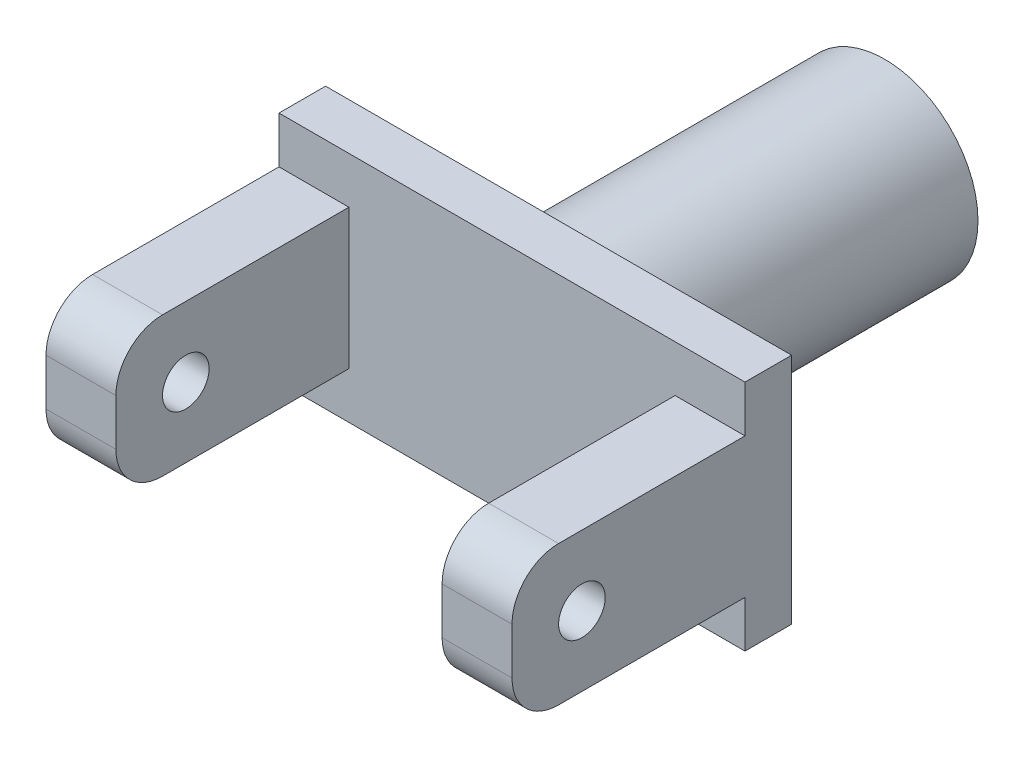
ISO-10303-21;
HEADER;
FILE_DESCRIPTION(('STEP AP214'),'2;1');
FILE_NAME('part.step','',(''),(''),'','','');
FILE_SCHEMA(('AUTOMOTIVE_DESIGN { 1 0 10303 214 1 1 1 1 }'));
ENDSEC;
DATA;
#1=APPLICATION_CONTEXT('core data for automotive mechanical design processes');
#2=APPLICATION_PROTOCOL_DEFINITION('international standard','automotive_design',2000,#1);
#3=PRODUCT_CONTEXT('',#1,'mechanical');
#4=PRODUCT('Part','Part','',(#3));
#5=PRODUCT_RELATED_PRODUCT_CATEGORY('part','',(#4));
#6=PRODUCT_DEFINITION_FORMATION('','',#4);
#7=PRODUCT_DEFINITION_CONTEXT('part definition',#1,'design');
#8=PRODUCT_DEFINITION('design','',#6,#7);
#9=PRODUCT_DEFINITION_SHAPE('','',#8);
#10=(LENGTH_UNIT() NAMED_UNIT(*) SI_UNIT(.MILLI.,.METRE.));
#11=(NAMED_UNIT(*) PLANE_ANGLE_UNIT() SI_UNIT($,.RADIAN.));
#12=(NAMED_UNIT(*) SI_UNIT($,.STERADIAN.) SOLID_ANGLE_UNIT());
#13=UNCERTAINTY_MEASURE_WITH_UNIT(LENGTH_MEASURE(1.E-05),#10,'distance_accuracy_value','');
#14=(GEOMETRIC_REPRESENTATION_CONTEXT(3) GLOBAL_UNCERTAINTY_ASSIGNED_CONTEXT((#13)) GLOBAL_UNIT_ASSIGNED_CONTEXT((#10,
#11,#12)) REPRESENTATION_CONTEXT('',''));
#15=CARTESIAN_POINT('',(0.,0.,0.));
#16=DIRECTION('',(0.,0.,1.));
#17=DIRECTION('',(1.,0.,0.));
#18=AXIS2_PLACEMENT_3D('',#15,#16,#17);
#19=CARTESIAN_POINT('',(0.,0.,80.));
#20=DIRECTION('',(0.,0.,-1.));
#21=DIRECTION('',(-1.,0.,0.));
#22=AXIS2_PLACEMENT_3D('',#19,#20,#21);
#23=PLANE('',#22);
#24=DIRECTION('',(0.,1.,0.));
#25=VECTOR('',#24,1.);
#26=CARTESIAN_POINT('',(50.,-25.,80.));
#27=LINE('',#26,#25);
#28=CARTESIAN_POINT('',(50.,-25.,80.));
#29=VERTEX_POINT('',#28);
#30=CARTESIAN_POINT('',(50.,-15.,80.));
#31=VERTEX_POINT('',#30);
#32=EDGE_CURVE('E171',#29,#31,#27,.T.);
#33=ORIENTED_EDGE('',*,*,#32,.T.);
#34=DIRECTION('',(-1.,0.,0.));
#35=VECTOR('',#34,1.);
#36=CARTESIAN_POINT('',(50.,-15.,80.));
#37=LINE('',#36,#35);
#38=CARTESIAN_POINT('',(35.,-15.,80.));
#39=VERTEX_POINT('',#38);
#40=EDGE_CURVE('E180',#31,#39,#37,.T.);
#41=ORIENTED_EDGE('',*,*,#40,.T.);
#42=DIRECTION('',(0.,1.,0.));
#43=VECTOR('',#42,1.);
#44=CARTESIAN_POINT('',(35.,-15.,80.));
#45=LINE('',#44,#43);
#46=CARTESIAN_POINT('',(35.,15.,80.));
#47=VERTEX_POINT('',#46);
#48=EDGE_CURVE('E178',#39,#47,#45,.T.);
#49=ORIENTED_EDGE('',*,*,#48,.T.);
#50=DIRECTION('',(1.,0.,0.));
#51=VECTOR('',#50,1.);
#52=CARTESIAN_POINT('',(50.,15.,80.));
#53=LINE('',#52,#51);
#54=CARTESIAN_POINT('',(50.,15.,80.));
#55=VERTEX_POINT('',#54);
#56=EDGE_CURVE('E156',#47,#55,#53,.T.);
#57=ORIENTED_EDGE('',*,*,#56,.T.);
#58=CARTESIAN_POINT('',(50.,25.,80.));
#59=VERTEX_POINT('',#58);
#60=EDGE_CURVE('E164',#55,#59,#27,.T.);
#61=ORIENTED_EDGE('',*,*,#60,.T.);
#62=DIRECTION('',(-1.,0.,0.));
#63=VECTOR('',#62,1.);
#64=CARTESIAN_POINT('',(-50.,25.,80.));
#65=LINE('',#64,#63);
#66=CARTESIAN_POINT('',(-50.,25.,80.));
#67=VERTEX_POINT('',#66);
#68=EDGE_CURVE('E392',#59,#67,#65,.T.);
#69=ORIENTED_EDGE('',*,*,#68,.T.);
#70=DIRECTION('',(0.,-1.,0.));
#71=VECTOR('',#70,1.);
#72=CARTESIAN_POINT('',(-50.,-25.,80.));
#73=LINE('',#72,#71);
#74=CARTESIAN_POINT('',(-50.,15.,80.));
#75=VERTEX_POINT('',#74);
#76=EDGE_CURVE('E387',#67,#75,#73,.T.);
#77=ORIENTED_EDGE('',*,*,#76,.T.);
#78=DIRECTION('',(-1.,0.,0.));
#79=VECTOR('',#78,1.);
#80=CARTESIAN_POINT('',(-50.,15.,80.));
#81=LINE('',#80,#79);
#82=CARTESIAN_POINT('',(-35.,15.,80.));
#83=VERTEX_POINT('',#82);
#84=EDGE_CURVE('E206',#83,#75,#81,.T.);
#85=ORIENTED_EDGE('',*,*,#84,.F.);
#86=DIRECTION('',(0.,1.,0.));
#87=VECTOR('',#86,1.);
#88=CARTESIAN_POINT('',(-35.,-15.,80.));
#89=LINE('',#88,#87);
#90=CARTESIAN_POINT('',(-35.,-15.,80.));
#91=VERTEX_POINT('',#90);
#92=EDGE_CURVE('E203',#91,#83,#89,.T.);
#93=ORIENTED_EDGE('',*,*,#92,.F.);
#94=DIRECTION('',(1.,0.,0.));
#95=VECTOR('',#94,1.);
#96=CARTESIAN_POINT('',(-50.,-15.,80.));
#97=LINE('',#96,#95);
#98=CARTESIAN_POINT('',(-50.,-15.,80.));
#99=VERTEX_POINT('',#98);
#100=EDGE_CURVE('E199',#99,#91,#97,.T.);
#101=ORIENTED_EDGE('',*,*,#100,.F.);
#102=CARTESIAN_POINT('',(-50.,-25.,80.));
#103=VERTEX_POINT('',#102);
#104=EDGE_CURVE('E214',#99,#103,#73,.T.);
#105=ORIENTED_EDGE('',*,*,#104,.T.);
#106=DIRECTION('',(1.,0.,0.));
#107=VECTOR('',#106,1.);
#108=CARTESIAN_POINT('',(-50.,-25.,80.));
#109=LINE('',#108,#107);
#110=EDGE_CURVE('E388',#103,#29,#109,.T.);
#111=ORIENTED_EDGE('',*,*,#110,.T.);
#112=EDGE_LOOP('',(#33,#41,#49,#57,#61,#69,#77,#85,#93,#101,#105,#111));
#113=FACE_BOUND('',#112,.T.);
#114=ADVANCED_FACE('F34',(#113),#23,.F.);
#115=CARTESIAN_POINT('',(0.,0.,0.));
#116=DIRECTION('',(0.,0.,1.));
#117=DIRECTION('',(1.,0.,0.));
#118=AXIS2_PLACEMENT_3D('',#115,#116,#117);
#119=PLANE('',#118);
#120=CARTESIAN_POINT('',(0.,0.,0.));
#121=DIRECTION('',(0.,0.,1.));
#122=DIRECTION('',(1.,0.,0.));
#123=AXIS2_PLACEMENT_3D('',#120,#121,#122);
#124=CIRCLE('',#123,20.);
#125=CARTESIAN_POINT('',(20.,0.,0.));
#126=VERTEX_POINT('',#125);
#127=EDGE_CURVE('E377',#126,#126,#124,.T.);
#128=ORIENTED_EDGE('',*,*,#127,.F.);
#129=EDGE_LOOP('',(#128));
#130=FACE_BOUND('',#129,.T.);
#131=CARTESIAN_POINT('',(0.,0.,0.));
#132=DIRECTION('',(0.,0.,1.));
#133=DIRECTION('',(1.,0.,0.));
#134=AXIS2_PLACEMENT_3D('',#131,#132,#133);
#135=CIRCLE('',#134,15.);
#136=CARTESIAN_POINT('',(15.,0.,0.));
#137=VERTEX_POINT('',#136);
#138=EDGE_CURVE('E383',#137,#137,#135,.T.);
#139=ORIENTED_EDGE('',*,*,#138,.T.);
#140=EDGE_LOOP('',(#139));
#141=FACE_BOUND('',#140,.T.);
#142=ADVANCED_FACE('F279',(#130,#141),#119,.F.);
#143=CARTESIAN_POINT('',(0.,0.,70.));
#144=DIRECTION('',(0.,0.,-1.));
#145=DIRECTION('',(-1.,0.,0.));
#146=AXIS2_PLACEMENT_3D('',#143,#144,#145);
#147=CYLINDRICAL_SURFACE('',#146,20.);
#148=CARTESIAN_POINT('',(0.,0.,70.));
#149=DIRECTION('',(0.,0.,1.));
#150=DIRECTION('',(1.,0.,0.));
#151=AXIS2_PLACEMENT_3D('',#148,#149,#150);
#152=CIRCLE('',#151,20.);
#153=CARTESIAN_POINT('',(20.,0.,70.));
#154=VERTEX_POINT('',#153);
#155=EDGE_CURVE('E374',#154,#154,#152,.T.);
#156=ORIENTED_EDGE('',*,*,#155,.F.);
#157=EDGE_LOOP('',(#156));
#158=FACE_BOUND('',#157,.T.);
#159=ORIENTED_EDGE('',*,*,#127,.T.);
#160=EDGE_LOOP('',(#159));
#161=FACE_BOUND('',#160,.T.);
#162=ADVANCED_FACE('F284',(#158,#161),#147,.T.);
#163=CARTESIAN_POINT('',(0.,0.,70.));
#164=DIRECTION('',(0.,0.,-1.));
#165=DIRECTION('',(-1.,0.,0.));
#166=AXIS2_PLACEMENT_3D('',#163,#164,#165);
#167=CYLINDRICAL_SURFACE('',#166,15.);
#168=CARTESIAN_POINT('',(0.,0.,70.));
#169=DIRECTION('',(0.,0.,-1.));
#170=DIRECTION('',(-1.,0.,0.));
#171=AXIS2_PLACEMENT_3D('',#168,#169,#170);
#172=CIRCLE('',#171,15.);
#173=CARTESIAN_POINT('',(-15.,0.,70.));
#174=VERTEX_POINT('',#173);
#175=EDGE_CURVE('E411',#174,#174,#172,.T.);
#176=ORIENTED_EDGE('',*,*,#175,.F.);
#177=EDGE_LOOP('',(#176));
#178=FACE_BOUND('',#177,.T.);
#179=ORIENTED_EDGE('',*,*,#138,.F.);
#180=EDGE_LOOP('',(#179));
#181=FACE_BOUND('',#180,.T.);
#182=ADVANCED_FACE('F310',(#178,#181),#167,.F.);
#183=CARTESIAN_POINT('',(0.,0.,70.));
#184=DIRECTION('',(0.,0.,-1.));
#185=DIRECTION('',(-1.,0.,0.));
#186=AXIS2_PLACEMENT_3D('',#183,#184,#185);
#187=PLANE('',#186);
#188=ORIENTED_EDGE('',*,*,#175,.T.);
#189=EDGE_LOOP('',(#188));
#190=FACE_BOUND('',#189,.T.);
#191=ADVANCED_FACE('F296',(#190),#187,.T.);
#192=CARTESIAN_POINT('',(50.,-25.,80.));
#193=DIRECTION('',(-1.,0.,0.));
#194=DIRECTION('',(0.,0.,1.));
#195=AXIS2_PLACEMENT_3D('',#192,#193,#194);
#196=PLANE('',#195);
#197=CARTESIAN_POINT('',(50.,0.,115.));
#198=DIRECTION('',(-1.,0.,0.));
#199=DIRECTION('',(0.,0.,1.));
#200=AXIS2_PLACEMENT_3D('',#197,#198,#199);
#201=CIRCLE('',#200,5.);
#202=CARTESIAN_POINT('',(50.,0.,120.));
#203=VERTEX_POINT('',#202);
#204=EDGE_CURVE('E263',#203,#203,#201,.T.);
#205=ORIENTED_EDGE('',*,*,#204,.T.);
#206=EDGE_LOOP('',(#205));
#207=FACE_BOUND('',#206,.T.);
#208=DIRECTION('',(0.,0.,-1.));
#209=VECTOR('',#208,1.);
#210=CARTESIAN_POINT('',(50.,15.,130.));
#211=LINE('',#210,#209);
#212=CARTESIAN_POINT('',(50.,15.,120.));
#213=VERTEX_POINT('',#212);
#214=EDGE_CURVE('E151',#213,#55,#211,.T.);
#215=ORIENTED_EDGE('',*,*,#214,.F.);
#216=CARTESIAN_POINT('',(50.,4.99999999999999,120.));
#217=DIRECTION('',(-1.,0.,0.));
#218=DIRECTION('',(0.,0.,1.));
#219=AXIS2_PLACEMENT_3D('',#216,#217,#218);
#220=CIRCLE('',#219,10.);
#221=CARTESIAN_POINT('',(50.,4.99999999999999,130.));
#222=VERTEX_POINT('',#221);
#223=EDGE_CURVE('E246',#213,#222,#220,.F.);
#224=ORIENTED_EDGE('',*,*,#223,.T.);
#225=DIRECTION('',(0.,-1.,0.));
#226=VECTOR('',#225,1.);
#227=CARTESIAN_POINT('',(50.,-15.,130.));
#228=LINE('',#227,#226);
#229=CARTESIAN_POINT('',(50.,-4.99999999999998,130.));
#230=VERTEX_POINT('',#229);
#231=EDGE_CURVE('E182',#222,#230,#228,.T.);
#232=ORIENTED_EDGE('',*,*,#231,.T.);
#233=CARTESIAN_POINT('',(50.,-4.99999999999998,120.));
#234=DIRECTION('',(-1.,0.,0.));
#235=DIRECTION('',(0.,0.,1.));
#236=AXIS2_PLACEMENT_3D('',#233,#234,#235);
#237=CIRCLE('',#236,10.);
#238=CARTESIAN_POINT('',(50.,-15.,120.));
#239=VERTEX_POINT('',#238);
#240=EDGE_CURVE('E244',#230,#239,#237,.F.);
#241=ORIENTED_EDGE('',*,*,#240,.T.);
#242=DIRECTION('',(0.,0.,-1.));
#243=VECTOR('',#242,1.);
#244=CARTESIAN_POINT('',(50.,-15.,130.));
#245=LINE('',#244,#243);
#246=EDGE_CURVE('E160',#239,#31,#245,.T.);
#247=ORIENTED_EDGE('',*,*,#246,.T.);
#248=ORIENTED_EDGE('',*,*,#32,.F.);
#249=DIRECTION('',(0.,0.,-1.));
#250=VECTOR('',#249,1.);
#251=CARTESIAN_POINT('',(50.,-25.,80.));
#252=LINE('',#251,#250);
#253=CARTESIAN_POINT('',(50.,-25.,70.));
#254=VERTEX_POINT('',#253);
#255=EDGE_CURVE('E395',#29,#254,#252,.T.);
#256=ORIENTED_EDGE('',*,*,#255,.T.);
#257=DIRECTION('',(0.,1.,0.));
#258=VECTOR('',#257,1.);
#259=CARTESIAN_POINT('',(50.,-25.,70.));
#260=LINE('',#259,#258);
#261=CARTESIAN_POINT('',(50.,25.,70.));
#262=VERTEX_POINT('',#261);
#263=EDGE_CURVE('E396',#254,#262,#260,.T.);
#264=ORIENTED_EDGE('',*,*,#263,.T.);
#265=DIRECTION('',(0.,0.,-1.));
#266=VECTOR('',#265,1.);
#267=CARTESIAN_POINT('',(50.,25.,80.));
#268=LINE('',#267,#266);
#269=EDGE_CURVE('E168',#59,#262,#268,.T.);
#270=ORIENTED_EDGE('',*,*,#269,.F.);
#271=ORIENTED_EDGE('',*,*,#60,.F.);
#272=EDGE_LOOP('',(#215,#224,#232,#241,#247,#248,#256,#264,#270,#271));
#273=FACE_BOUND('',#272,.T.);
#274=ADVANCED_FACE('F165',(#207,#273),#196,.F.);
#275=CARTESIAN_POINT('',(-50.,25.,80.));
#276=DIRECTION('',(0.,-1.,0.));
#277=DIRECTION('',(0.,0.,-1.));
#278=AXIS2_PLACEMENT_3D('',#275,#276,#277);
#279=PLANE('',#278);
#280=DIRECTION('',(-1.,0.,0.));
#281=VECTOR('',#280,1.);
#282=CARTESIAN_POINT('',(-50.,25.,70.));
#283=LINE('',#282,#281);
#284=CARTESIAN_POINT('',(-50.,25.,70.));
#285=VERTEX_POINT('',#284);
#286=EDGE_CURVE('E398',#262,#285,#283,.T.);
#287=ORIENTED_EDGE('',*,*,#286,.T.);
#288=DIRECTION('',(0.,0.,-1.));
#289=VECTOR('',#288,1.);
#290=CARTESIAN_POINT('',(-50.,25.,80.));
#291=LINE('',#290,#289);
#292=EDGE_CURVE('E408',#67,#285,#291,.T.);
#293=ORIENTED_EDGE('',*,*,#292,.F.);
#294=ORIENTED_EDGE('',*,*,#68,.F.);
#295=ORIENTED_EDGE('',*,*,#269,.T.);
#296=EDGE_LOOP('',(#287,#293,#294,#295));
#297=FACE_BOUND('',#296,.T.);
#298=ADVANCED_FACE('F303',(#297),#279,.F.);
#299=CARTESIAN_POINT('',(-50.,-25.,80.));
#300=DIRECTION('',(1.,0.,0.));
#301=DIRECTION('',(0.,0.,-1.));
#302=AXIS2_PLACEMENT_3D('',#299,#300,#301);
#303=PLANE('',#302);
#304=CARTESIAN_POINT('',(-50.,0.,115.));
#305=DIRECTION('',(-1.,0.,0.));
#306=DIRECTION('',(0.,0.,1.));
#307=AXIS2_PLACEMENT_3D('',#304,#305,#306);
#308=CIRCLE('',#307,5.);
#309=CARTESIAN_POINT('',(-50.,0.,120.));
#310=VERTEX_POINT('',#309);
#311=EDGE_CURVE('E191',#310,#310,#308,.T.);
#312=ORIENTED_EDGE('',*,*,#311,.F.);
#313=EDGE_LOOP('',(#312));
#314=FACE_BOUND('',#313,.T.);
#315=DIRECTION('',(0.,-1.,0.));
#316=VECTOR('',#315,1.);
#317=CARTESIAN_POINT('',(-50.,-15.,130.));
#318=LINE('',#317,#316);
#319=CARTESIAN_POINT('',(-50.,4.99999999999999,130.));
#320=VERTEX_POINT('',#319);
#321=CARTESIAN_POINT('',(-50.,-4.99999999999998,130.));
#322=VERTEX_POINT('',#321);
#323=EDGE_CURVE('E198',#320,#322,#318,.T.);
#324=ORIENTED_EDGE('',*,*,#323,.F.);
#325=CARTESIAN_POINT('',(-50.,4.99999999999999,120.));
#326=DIRECTION('',(1.,0.,0.));
#327=DIRECTION('',(0.,0.,-1.));
#328=AXIS2_PLACEMENT_3D('',#325,#326,#327);
#329=CIRCLE('',#328,10.);
#330=CARTESIAN_POINT('',(-50.,15.,120.));
#331=VERTEX_POINT('',#330);
#332=EDGE_CURVE('E230',#320,#331,#329,.F.);
#333=ORIENTED_EDGE('',*,*,#332,.T.);
#334=DIRECTION('',(0.,0.,-1.));
#335=VECTOR('',#334,1.);
#336=CARTESIAN_POINT('',(-50.,15.,130.));
#337=LINE('',#336,#335);
#338=EDGE_CURVE('E221',#331,#75,#337,.T.);
#339=ORIENTED_EDGE('',*,*,#338,.T.);
#340=ORIENTED_EDGE('',*,*,#76,.F.);
#341=ORIENTED_EDGE('',*,*,#292,.T.);
#342=DIRECTION('',(0.,-1.,0.));
#343=VECTOR('',#342,1.);
#344=CARTESIAN_POINT('',(-50.,-25.,70.));
#345=LINE('',#344,#343);
#346=CARTESIAN_POINT('',(-50.,-25.,70.));
#347=VERTEX_POINT('',#346);
#348=EDGE_CURVE('E400',#285,#347,#345,.T.);
#349=ORIENTED_EDGE('',*,*,#348,.T.);
#350=DIRECTION('',(0.,0.,-1.));
#351=VECTOR('',#350,1.);
#352=CARTESIAN_POINT('',(-50.,-25.,80.));
#353=LINE('',#352,#351);
#354=EDGE_CURVE('E405',#103,#347,#353,.T.);
#355=ORIENTED_EDGE('',*,*,#354,.F.);
#356=ORIENTED_EDGE('',*,*,#104,.F.);
#357=DIRECTION('',(0.,0.,-1.));
#358=VECTOR('',#357,1.);
#359=CARTESIAN_POINT('',(-50.,-15.,130.));
#360=LINE('',#359,#358);
#361=CARTESIAN_POINT('',(-50.,-15.,120.));
#362=VERTEX_POINT('',#361);
#363=EDGE_CURVE('E225',#362,#99,#360,.T.);
#364=ORIENTED_EDGE('',*,*,#363,.F.);
#365=CARTESIAN_POINT('',(-50.,-4.99999999999998,120.));
#366=DIRECTION('',(1.,0.,0.));
#367=DIRECTION('',(0.,0.,-1.));
#368=AXIS2_PLACEMENT_3D('',#365,#366,#367);
#369=CIRCLE('',#368,10.);
#370=EDGE_CURVE('E228',#362,#322,#369,.F.);
#371=ORIENTED_EDGE('',*,*,#370,.T.);
#372=EDGE_LOOP('',(#324,#333,#339,#340,#341,#349,#355,#356,#364,#371));
#373=FACE_BOUND('',#372,.T.);
#374=ADVANCED_FACE('F299',(#314,#373),#303,.F.);
#375=CARTESIAN_POINT('',(-50.,-25.,80.));
#376=DIRECTION('',(0.,1.,0.));
#377=DIRECTION('',(0.,0.,1.));
#378=AXIS2_PLACEMENT_3D('',#375,#376,#377);
#379=PLANE('',#378);
#380=DIRECTION('',(1.,0.,0.));
#381=VECTOR('',#380,1.);
#382=CARTESIAN_POINT('',(-50.,-25.,70.));
#383=LINE('',#382,#381);
#384=EDGE_CURVE('E172',#347,#254,#383,.T.);
#385=ORIENTED_EDGE('',*,*,#384,.T.);
#386=ORIENTED_EDGE('',*,*,#255,.F.);
#387=ORIENTED_EDGE('',*,*,#110,.F.);
#388=ORIENTED_EDGE('',*,*,#354,.T.);
#389=EDGE_LOOP('',(#385,#386,#387,#388));
#390=FACE_BOUND('',#389,.T.);
#391=ADVANCED_FACE('F294',(#390),#379,.F.);
#392=ORIENTED_EDGE('',*,*,#155,.T.);
#393=EDGE_LOOP('',(#392));
#394=FACE_BOUND('',#393,.T.);
#395=ORIENTED_EDGE('',*,*,#263,.F.);
#396=ORIENTED_EDGE('',*,*,#384,.F.);
#397=ORIENTED_EDGE('',*,*,#348,.F.);
#398=ORIENTED_EDGE('',*,*,#286,.F.);
#399=EDGE_LOOP('',(#395,#396,#397,#398));
#400=FACE_BOUND('',#399,.T.);
#401=ADVANCED_FACE('F291',(#394,#400),#187,.T.);
#402=CARTESIAN_POINT('',(-35.,-15.,130.));
#403=DIRECTION('',(-1.,0.,0.));
#404=DIRECTION('',(0.,0.,1.));
#405=AXIS2_PLACEMENT_3D('',#402,#403,#404);
#406=PLANE('',#405);
#407=CARTESIAN_POINT('',(-35.,0.,115.));
#408=DIRECTION('',(-1.,0.,0.));
#409=DIRECTION('',(0.,0.,1.));
#410=AXIS2_PLACEMENT_3D('',#407,#408,#409);
#411=CIRCLE('',#410,5.);
#412=CARTESIAN_POINT('',(-35.,0.,120.));
#413=VERTEX_POINT('',#412);
#414=EDGE_CURVE('E194',#413,#413,#411,.T.);
#415=ORIENTED_EDGE('',*,*,#414,.T.);
#416=EDGE_LOOP('',(#415));
#417=FACE_BOUND('',#416,.T.);
#418=DIRECTION('',(0.,0.,-1.));
#419=VECTOR('',#418,1.);
#420=CARTESIAN_POINT('',(-35.,15.,130.));
#421=LINE('',#420,#419);
#422=CARTESIAN_POINT('',(-35.,15.,120.));
#423=VERTEX_POINT('',#422);
#424=EDGE_CURVE('E224',#423,#83,#421,.T.);
#425=ORIENTED_EDGE('',*,*,#424,.F.);
#426=CARTESIAN_POINT('',(-35.,5.,120.));
#427=DIRECTION('',(-1.,0.,0.));
#428=DIRECTION('',(0.,0.,1.));
#429=AXIS2_PLACEMENT_3D('',#426,#427,#428);
#430=CIRCLE('',#429,10.);
#431=CARTESIAN_POINT('',(-35.,4.99999999999999,130.));
#432=VERTEX_POINT('',#431);
#433=EDGE_CURVE('E237',#423,#432,#430,.F.);
#434=ORIENTED_EDGE('',*,*,#433,.T.);
#435=DIRECTION('',(0.,1.,0.));
#436=VECTOR('',#435,1.);
#437=CARTESIAN_POINT('',(-35.,-15.,130.));
#438=LINE('',#437,#436);
#439=CARTESIAN_POINT('',(-35.,-5.00000000000001,130.));
#440=VERTEX_POINT('',#439);
#441=EDGE_CURVE('E195',#440,#432,#438,.T.);
#442=ORIENTED_EDGE('',*,*,#441,.F.);
#443=CARTESIAN_POINT('',(-35.,-5.00000000000001,120.));
#444=DIRECTION('',(-1.,0.,0.));
#445=DIRECTION('',(0.,0.,1.));
#446=AXIS2_PLACEMENT_3D('',#443,#444,#445);
#447=CIRCLE('',#446,10.);
#448=CARTESIAN_POINT('',(-35.,-15.,120.));
#449=VERTEX_POINT('',#448);
#450=EDGE_CURVE('E235',#440,#449,#447,.F.);
#451=ORIENTED_EDGE('',*,*,#450,.T.);
#452=DIRECTION('',(0.,0.,-1.));
#453=VECTOR('',#452,1.);
#454=CARTESIAN_POINT('',(-35.,-15.,130.));
#455=LINE('',#454,#453);
#456=EDGE_CURVE('E202',#449,#91,#455,.T.);
#457=ORIENTED_EDGE('',*,*,#456,.T.);
#458=ORIENTED_EDGE('',*,*,#92,.T.);
#459=EDGE_LOOP('',(#425,#434,#442,#451,#457,#458));
#460=FACE_BOUND('',#459,.T.);
#461=ADVANCED_FACE('F289',(#417,#460),#406,.F.);
#462=CARTESIAN_POINT('',(-50.,15.,130.));
#463=DIRECTION('',(0.,-1.,0.));
#464=DIRECTION('',(1.,0.,0.));
#465=AXIS2_PLACEMENT_3D('',#462,#463,#464);
#466=PLANE('',#465);
#467=ORIENTED_EDGE('',*,*,#338,.F.);
#468=DIRECTION('',(-1.,0.,0.));
#469=VECTOR('',#468,1.);
#470=CARTESIAN_POINT('',(-50.,15.,120.));
#471=LINE('',#470,#469);
#472=EDGE_CURVE('E233',#331,#423,#471,.F.);
#473=ORIENTED_EDGE('',*,*,#472,.T.);
#474=ORIENTED_EDGE('',*,*,#424,.T.);
#475=ORIENTED_EDGE('',*,*,#84,.T.);
#476=EDGE_LOOP('',(#467,#473,#474,#475));
#477=FACE_BOUND('',#476,.T.);
#478=ADVANCED_FACE('F349',(#477),#466,.F.);
#479=CARTESIAN_POINT('',(-50.,-15.,130.));
#480=DIRECTION('',(0.,1.,0.));
#481=DIRECTION('',(-1.,0.,0.));
#482=AXIS2_PLACEMENT_3D('',#479,#480,#481);
#483=PLANE('',#482);
#484=ORIENTED_EDGE('',*,*,#456,.F.);
#485=DIRECTION('',(1.,0.,0.));
#486=VECTOR('',#485,1.);
#487=CARTESIAN_POINT('',(-50.,-15.,120.));
#488=LINE('',#487,#486);
#489=EDGE_CURVE('E239',#449,#362,#488,.F.);
#490=ORIENTED_EDGE('',*,*,#489,.T.);
#491=ORIENTED_EDGE('',*,*,#363,.T.);
#492=ORIENTED_EDGE('',*,*,#100,.T.);
#493=EDGE_LOOP('',(#484,#490,#491,#492));
#494=FACE_BOUND('',#493,.T.);
#495=ADVANCED_FACE('F346',(#494),#483,.F.);
#496=CARTESIAN_POINT('',(0.,0.,130.));
#497=DIRECTION('',(0.,0.,-1.));
#498=DIRECTION('',(-1.,0.,0.));
#499=AXIS2_PLACEMENT_3D('',#496,#497,#498);
#500=PLANE('',#499);
#501=ORIENTED_EDGE('',*,*,#441,.T.);
#502=DIRECTION('',(-1.,0.,0.));
#503=VECTOR('',#502,1.);
#504=CARTESIAN_POINT('',(0.,5.00000000000001,130.));
#505=LINE('',#504,#503);
#506=EDGE_CURVE('E231',#432,#320,#505,.T.);
#507=ORIENTED_EDGE('',*,*,#506,.T.);
#508=ORIENTED_EDGE('',*,*,#323,.T.);
#509=DIRECTION('',(1.,0.,0.));
#510=VECTOR('',#509,1.);
#511=CARTESIAN_POINT('',(0.,-5.00000000000006,130.));
#512=LINE('',#511,#510);
#513=EDGE_CURVE('E372',#322,#440,#512,.T.);
#514=ORIENTED_EDGE('',*,*,#513,.T.);
#515=EDGE_LOOP('',(#501,#507,#508,#514));
#516=FACE_BOUND('',#515,.T.);
#517=ADVANCED_FACE('F321',(#516),#500,.F.);
#518=CARTESIAN_POINT('',(0.,5.00000000000001,120.));
#519=DIRECTION('',(-1.,0.,0.));
#520=DIRECTION('',(0.,-1.,0.));
#521=AXIS2_PLACEMENT_3D('',#518,#519,#520);
#522=CYLINDRICAL_SURFACE('',#521,10.);
#523=ORIENTED_EDGE('',*,*,#433,.F.);
#524=ORIENTED_EDGE('',*,*,#472,.F.);
#525=ORIENTED_EDGE('',*,*,#332,.F.);
#526=ORIENTED_EDGE('',*,*,#506,.F.);
#527=EDGE_LOOP('',(#523,#524,#525,#526));
#528=FACE_BOUND('',#527,.T.);
#529=ADVANCED_FACE('F317',(#528),#522,.T.);
#530=CARTESIAN_POINT('',(0.,-5.00000000000006,120.));
#531=DIRECTION('',(1.,0.,0.));
#532=DIRECTION('',(0.,1.,0.));
#533=AXIS2_PLACEMENT_3D('',#530,#531,#532);
#534=CYLINDRICAL_SURFACE('',#533,10.);
#535=ORIENTED_EDGE('',*,*,#370,.F.);
#536=ORIENTED_EDGE('',*,*,#489,.F.);
#537=ORIENTED_EDGE('',*,*,#450,.F.);
#538=ORIENTED_EDGE('',*,*,#513,.F.);
#539=EDGE_LOOP('',(#535,#536,#537,#538));
#540=FACE_BOUND('',#539,.T.);
#541=ADVANCED_FACE('F320',(#540),#534,.T.);
#542=CARTESIAN_POINT('',(0.,0.,115.));
#543=DIRECTION('',(-1.,0.,0.));
#544=DIRECTION('',(0.,0.,1.));
#545=AXIS2_PLACEMENT_3D('',#542,#543,#544);
#546=CYLINDRICAL_SURFACE('',#545,5.);
#547=ORIENTED_EDGE('',*,*,#311,.T.);
#548=EDGE_LOOP('',(#547));
#549=FACE_BOUND('',#548,.T.);
#550=ORIENTED_EDGE('',*,*,#414,.F.);
#551=EDGE_LOOP('',(#550));
#552=FACE_BOUND('',#551,.T.);
#553=ADVANCED_FACE('F324',(#549,#552),#546,.F.);
#554=CARTESIAN_POINT('',(35.,-15.,130.));
#555=DIRECTION('',(-1.,0.,0.));
#556=DIRECTION('',(0.,0.,1.));
#557=AXIS2_PLACEMENT_3D('',#554,#555,#556);
#558=PLANE('',#557);
#559=CARTESIAN_POINT('',(35.,0.,115.));
#560=DIRECTION('',(-1.,0.,0.));
#561=DIRECTION('',(0.,0.,1.));
#562=AXIS2_PLACEMENT_3D('',#559,#560,#561);
#563=CIRCLE('',#562,5.);
#564=CARTESIAN_POINT('',(35.,0.,120.));
#565=VERTEX_POINT('',#564);
#566=EDGE_CURVE('E38',#565,#565,#563,.F.);
#567=ORIENTED_EDGE('',*,*,#566,.T.);
#568=EDGE_LOOP('',(#567));
#569=FACE_BOUND('',#568,.T.);
#570=DIRECTION('',(0.,1.,0.));
#571=VECTOR('',#570,1.);
#572=CARTESIAN_POINT('',(35.,-15.,130.));
#573=LINE('',#572,#571);
#574=CARTESIAN_POINT('',(35.,-5.00000000000001,130.));
#575=VERTEX_POINT('',#574);
#576=CARTESIAN_POINT('',(35.,4.99999999999999,130.));
#577=VERTEX_POINT('',#576);
#578=EDGE_CURVE('E179',#575,#577,#573,.T.);
#579=ORIENTED_EDGE('',*,*,#578,.T.);
#580=CARTESIAN_POINT('',(35.,5.,120.));
#581=DIRECTION('',(-1.,0.,0.));
#582=DIRECTION('',(0.,0.,1.));
#583=AXIS2_PLACEMENT_3D('',#580,#581,#582);
#584=CIRCLE('',#583,10.);
#585=CARTESIAN_POINT('',(35.,15.,120.));
#586=VERTEX_POINT('',#585);
#587=EDGE_CURVE('E43',#577,#586,#584,.T.);
#588=ORIENTED_EDGE('',*,*,#587,.T.);
#589=DIRECTION('',(0.,0.,-1.));
#590=VECTOR('',#589,1.);
#591=CARTESIAN_POINT('',(35.,15.,130.));
#592=LINE('',#591,#590);
#593=EDGE_CURVE('E161',#586,#47,#592,.T.);
#594=ORIENTED_EDGE('',*,*,#593,.T.);
#595=ORIENTED_EDGE('',*,*,#48,.F.);
#596=DIRECTION('',(0.,0.,-1.));
#597=VECTOR('',#596,1.);
#598=CARTESIAN_POINT('',(35.,-15.,130.));
#599=LINE('',#598,#597);
#600=CARTESIAN_POINT('',(35.,-15.,120.));
#601=VERTEX_POINT('',#600);
#602=EDGE_CURVE('E189',#601,#39,#599,.T.);
#603=ORIENTED_EDGE('',*,*,#602,.F.);
#604=CARTESIAN_POINT('',(35.,-5.00000000000001,120.));
#605=DIRECTION('',(-1.,0.,0.));
#606=DIRECTION('',(0.,0.,1.));
#607=AXIS2_PLACEMENT_3D('',#604,#605,#606);
#608=CIRCLE('',#607,10.);
#609=EDGE_CURVE('E50',#601,#575,#608,.T.);
#610=ORIENTED_EDGE('',*,*,#609,.T.);
#611=EDGE_LOOP('',(#579,#588,#594,#595,#603,#610));
#612=FACE_BOUND('',#611,.T.);
#613=ADVANCED_FACE('F254',(#569,#612),#558,.T.);
#614=CARTESIAN_POINT('',(50.,-15.,130.));
#615=DIRECTION('',(0.,-1.,0.));
#616=DIRECTION('',(1.,0.,0.));
#617=AXIS2_PLACEMENT_3D('',#614,#615,#616);
#618=PLANE('',#617);
#619=ORIENTED_EDGE('',*,*,#246,.F.);
#620=DIRECTION('',(-1.,0.,0.));
#621=VECTOR('',#620,1.);
#622=CARTESIAN_POINT('',(35.,-15.,120.));
#623=LINE('',#622,#621);
#624=EDGE_CURVE('E11',#239,#601,#623,.T.);
#625=ORIENTED_EDGE('',*,*,#624,.T.);
#626=ORIENTED_EDGE('',*,*,#602,.T.);
#627=ORIENTED_EDGE('',*,*,#40,.F.);
#628=EDGE_LOOP('',(#619,#625,#626,#627));
#629=FACE_BOUND('',#628,.T.);
#630=ADVANCED_FACE('F333',(#629),#618,.T.);
#631=CARTESIAN_POINT('',(50.,15.,130.));
#632=DIRECTION('',(0.,1.,0.));
#633=DIRECTION('',(-1.,0.,0.));
#634=AXIS2_PLACEMENT_3D('',#631,#632,#633);
#635=PLANE('',#634);
#636=ORIENTED_EDGE('',*,*,#593,.F.);
#637=DIRECTION('',(1.,0.,0.));
#638=VECTOR('',#637,1.);
#639=CARTESIAN_POINT('',(50.,15.,120.));
#640=LINE('',#639,#638);
#641=EDGE_CURVE('E158',#586,#213,#640,.T.);
#642=ORIENTED_EDGE('',*,*,#641,.T.);
#643=ORIENTED_EDGE('',*,*,#214,.T.);
#644=ORIENTED_EDGE('',*,*,#56,.F.);
#645=EDGE_LOOP('',(#636,#642,#643,#644));
#646=FACE_BOUND('',#645,.T.);
#647=ADVANCED_FACE('F154',(#646),#635,.T.);
#648=CARTESIAN_POINT('',(0.,0.,130.));
#649=DIRECTION('',(0.,0.,-1.));
#650=DIRECTION('',(1.,0.,0.));
#651=AXIS2_PLACEMENT_3D('',#648,#649,#650);
#652=PLANE('',#651);
#653=ORIENTED_EDGE('',*,*,#231,.F.);
#654=DIRECTION('',(1.,0.,0.));
#655=VECTOR('',#654,1.);
#656=CARTESIAN_POINT('',(35.,5.,130.));
#657=LINE('',#656,#655);
#658=EDGE_CURVE('E57',#222,#577,#657,.F.);
#659=ORIENTED_EDGE('',*,*,#658,.T.);
#660=ORIENTED_EDGE('',*,*,#578,.F.);
#661=DIRECTION('',(-1.,0.,0.));
#662=VECTOR('',#661,1.);
#663=CARTESIAN_POINT('',(50.,-4.99999999999998,130.));
#664=LINE('',#663,#662);
#665=EDGE_CURVE('E248',#575,#230,#664,.F.);
#666=ORIENTED_EDGE('',*,*,#665,.T.);
#667=EDGE_LOOP('',(#653,#659,#660,#666));
#668=FACE_BOUND('',#667,.T.);
#669=ADVANCED_FACE('F259',(#668),#652,.F.);
#670=CARTESIAN_POINT('',(50.,4.99999999999999,120.));
#671=DIRECTION('',(-1.,0.,0.));
#672=DIRECTION('',(0.,-1.,0.));
#673=AXIS2_PLACEMENT_3D('',#670,#671,#672);
#674=CYLINDRICAL_SURFACE('',#673,10.);
#675=ORIENTED_EDGE('',*,*,#587,.F.);
#676=ORIENTED_EDGE('',*,*,#658,.F.);
#677=ORIENTED_EDGE('',*,*,#223,.F.);
#678=ORIENTED_EDGE('',*,*,#641,.F.);
#679=EDGE_LOOP('',(#675,#676,#677,#678));
#680=FACE_BOUND('',#679,.T.);
#681=ADVANCED_FACE('F256',(#680),#674,.T.);
#682=CARTESIAN_POINT('',(50.,-4.99999999999998,120.));
#683=DIRECTION('',(1.,0.,0.));
#684=DIRECTION('',(0.,1.,0.));
#685=AXIS2_PLACEMENT_3D('',#682,#683,#684);
#686=CYLINDRICAL_SURFACE('',#685,10.);
#687=ORIENTED_EDGE('',*,*,#240,.F.);
#688=ORIENTED_EDGE('',*,*,#665,.F.);
#689=ORIENTED_EDGE('',*,*,#609,.F.);
#690=ORIENTED_EDGE('',*,*,#624,.F.);
#691=EDGE_LOOP('',(#687,#688,#689,#690));
#692=FACE_BOUND('',#691,.T.);
#693=ADVANCED_FACE('F36',(#692),#686,.T.);
#694=CARTESIAN_POINT('',(0.,0.,115.));
#695=DIRECTION('',(1.,0.,0.));
#696=DIRECTION('',(0.,0.,-1.));
#697=AXIS2_PLACEMENT_3D('',#694,#695,#696);
#698=CYLINDRICAL_SURFACE('',#697,5.);
#699=ORIENTED_EDGE('',*,*,#566,.F.);
#700=EDGE_LOOP('',(#699));
#701=FACE_BOUND('',#700,.T.);
#702=ORIENTED_EDGE('',*,*,#204,.F.);
#703=EDGE_LOOP('',(#702));
#704=FACE_BOUND('',#703,.T.);
#705=ADVANCED_FACE('F270',(#701,#704),#698,.F.);
#706=CLOSED_SHELL('',(#114,#142,#162,#182,#191,#274,#298,#374,#391,#401,#461,#478,#495,#517,
#529,#541,#553,#613,#630,#647,#669,#681,#693,#705));
#707=MANIFOLD_SOLID_BREP('B2',#706);
#708=ADVANCED_BREP_SHAPE_REPRESENTATION('',(#18,#707),#14);
#709=SHAPE_DEFINITION_REPRESENTATION(#9,#708);
ENDSEC;
END-ISO-10303-21;
